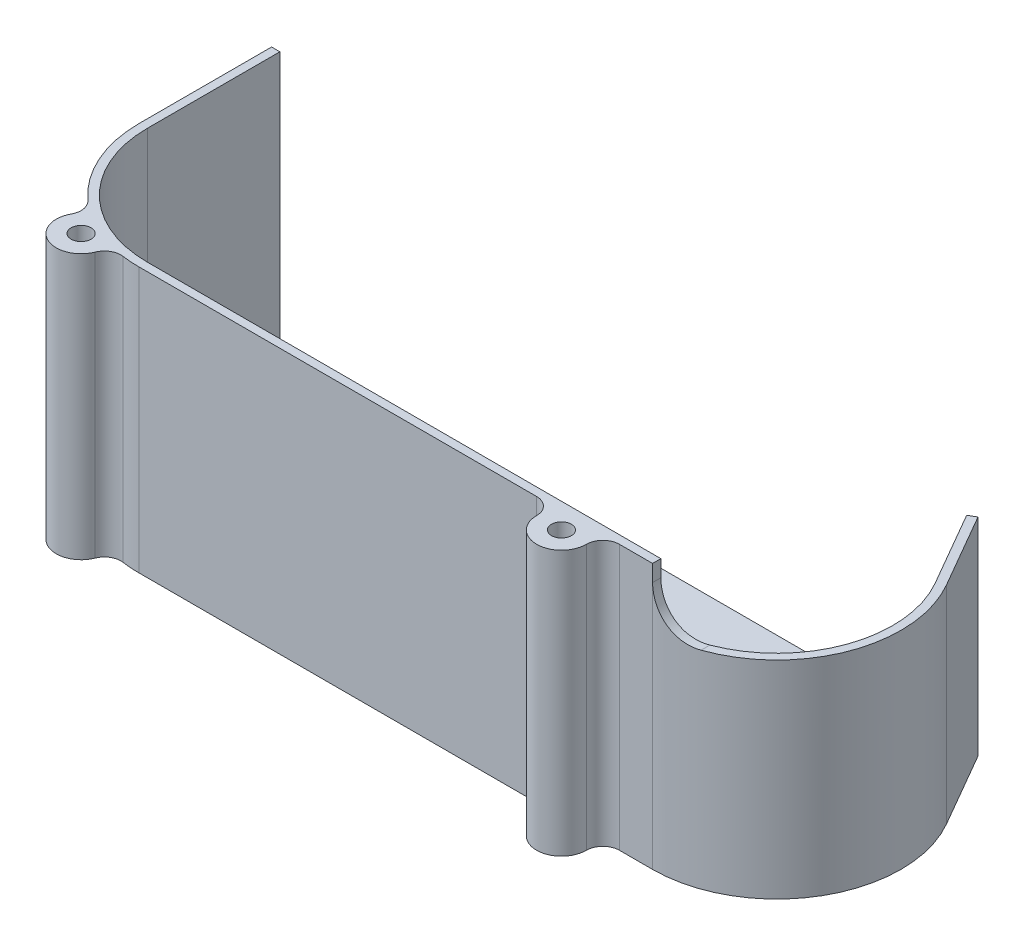
ISO-10303-21;
HEADER;
FILE_DESCRIPTION(('STEP AP214'),'2;1');
FILE_NAME('part.step','',(''),(''),'','','');
FILE_SCHEMA(('AUTOMOTIVE_DESIGN { 1 0 10303 214 1 1 1 1 }'));
ENDSEC;
DATA;
#1=APPLICATION_CONTEXT('core data for automotive mechanical design processes');
#2=APPLICATION_PROTOCOL_DEFINITION('international standard','automotive_design',2000,#1);
#3=PRODUCT_CONTEXT('',#1,'mechanical');
#4=PRODUCT('Part','Part','',(#3));
#5=PRODUCT_RELATED_PRODUCT_CATEGORY('part','',(#4));
#6=PRODUCT_DEFINITION_FORMATION('','',#4);
#7=PRODUCT_DEFINITION_CONTEXT('part definition',#1,'design');
#8=PRODUCT_DEFINITION('design','',#6,#7);
#9=PRODUCT_DEFINITION_SHAPE('','',#8);
#10=(LENGTH_UNIT() NAMED_UNIT(*) SI_UNIT(.MILLI.,.METRE.));
#11=(NAMED_UNIT(*) PLANE_ANGLE_UNIT() SI_UNIT($,.RADIAN.));
#12=(NAMED_UNIT(*) SI_UNIT($,.STERADIAN.) SOLID_ANGLE_UNIT());
#13=UNCERTAINTY_MEASURE_WITH_UNIT(LENGTH_MEASURE(1.E-05),#10,'distance_accuracy_value','');
#14=(GEOMETRIC_REPRESENTATION_CONTEXT(3) GLOBAL_UNCERTAINTY_ASSIGNED_CONTEXT((#13)) GLOBAL_UNIT_ASSIGNED_CONTEXT((#10,
#11,#12)) REPRESENTATION_CONTEXT('',''));
#15=CARTESIAN_POINT('',(0.,0.,0.));
#16=DIRECTION('',(0.,0.,1.));
#17=DIRECTION('',(1.,0.,0.));
#18=AXIS2_PLACEMENT_3D('',#15,#16,#17);
#19=CARTESIAN_POINT('',(12.9903810567665,32.,-21.5000000000002));
#20=DIRECTION('',(-0.866025403784433,0.,0.50000000000001));
#21=DIRECTION('',(0.50000000000001,0.,0.866025403784433));
#22=AXIS2_PLACEMENT_3D('',#19,#20,#21);
#23=PLANE('',#22);
#24=DIRECTION('',(-0.50000000000001,0.,-0.866025403784433));
#25=VECTOR('',#24,1.);
#26=CARTESIAN_POINT('',(12.9903810567665,25.,-21.5000000000002));
#27=LINE('',#26,#25);
#28=CARTESIAN_POINT('',(12.9903810567665,25.,-21.5000000000002));
#29=VERTEX_POINT('',#28);
#30=CARTESIAN_POINT('',(7.7942286340598,25.,-30.5));
#31=VERTEX_POINT('',#30);
#32=EDGE_CURVE('E310',#29,#31,#27,.T.);
#33=ORIENTED_EDGE('',*,*,#32,.F.);
#34=DIRECTION('',(0.,-1.,0.));
#35=VECTOR('',#34,1.);
#36=CARTESIAN_POINT('',(12.9903810567665,32.,-21.5000000000002));
#37=LINE('',#36,#35);
#38=CARTESIAN_POINT('',(12.9903810567665,0.,-21.5000000000002));
#39=VERTEX_POINT('',#38);
#40=EDGE_CURVE('E224',#29,#39,#37,.T.);
#41=ORIENTED_EDGE('',*,*,#40,.T.);
#42=DIRECTION('',(-0.50000000000001,0.,-0.866025403784433));
#43=VECTOR('',#42,1.);
#44=CARTESIAN_POINT('',(12.9903810567665,0.,-21.5000000000002));
#45=LINE('',#44,#43);
#46=CARTESIAN_POINT('',(7.79422863405981,0.,-30.5));
#47=VERTEX_POINT('',#46);
#48=EDGE_CURVE('E371',#39,#47,#45,.T.);
#49=ORIENTED_EDGE('',*,*,#48,.T.);
#50=DIRECTION('',(0.,-1.,0.));
#51=VECTOR('',#50,1.);
#52=CARTESIAN_POINT('',(7.79422863405981,32.,-30.5));
#53=LINE('',#52,#51);
#54=EDGE_CURVE('E253',#31,#47,#53,.T.);
#55=ORIENTED_EDGE('',*,*,#54,.F.);
#56=EDGE_LOOP('',(#33,#41,#49,#55));
#57=FACE_BOUND('',#56,.T.);
#58=ADVANCED_FACE('F37',(#57),#23,.F.);
#59=CARTESIAN_POINT('',(6.92820323027538,32.,-30.));
#60=DIRECTION('',(-0.500000000000011,0.,-0.866025403784432));
#61=DIRECTION('',(-0.866025403784432,0.,0.500000000000011));
#62=AXIS2_PLACEMENT_3D('',#59,#60,#61);
#63=PLANE('',#62);
#64=DIRECTION('',(0.,-1.,0.));
#65=VECTOR('',#64,1.);
#66=CARTESIAN_POINT('',(6.92820323027538,32.,-30.));
#67=LINE('',#66,#65);
#68=CARTESIAN_POINT('',(6.92820323027538,25.,-30.));
#69=VERTEX_POINT('',#68);
#70=CARTESIAN_POINT('',(6.92820323027538,1.,-30.));
#71=VERTEX_POINT('',#70);
#72=EDGE_CURVE('E251',#69,#71,#67,.T.);
#73=ORIENTED_EDGE('',*,*,#72,.F.);
#74=DIRECTION('',(0.866025403784432,0.,-0.500000000000011));
#75=VECTOR('',#74,1.);
#76=CARTESIAN_POINT('',(6.92820323027538,25.,-30.));
#77=LINE('',#76,#75);
#78=EDGE_CURVE('E518',#69,#31,#77,.T.);
#79=ORIENTED_EDGE('',*,*,#78,.T.);
#80=ORIENTED_EDGE('',*,*,#54,.T.);
#81=DIRECTION('',(0.866025403784432,0.,-0.500000000000011));
#82=VECTOR('',#81,1.);
#83=CARTESIAN_POINT('',(6.92820323027538,0.,-30.));
#84=LINE('',#83,#82);
#85=CARTESIAN_POINT('',(6.92820323027538,0.,-30.));
#86=VERTEX_POINT('',#85);
#87=EDGE_CURVE('E374',#86,#47,#84,.T.);
#88=ORIENTED_EDGE('',*,*,#87,.F.);
#89=DIRECTION('',(0.,-1.,0.));
#90=VECTOR('',#89,1.);
#91=CARTESIAN_POINT('',(6.92820323027538,1.,-30.));
#92=LINE('',#91,#90);
#93=EDGE_CURVE('E375',#71,#86,#92,.T.);
#94=ORIENTED_EDGE('',*,*,#93,.F.);
#95=EDGE_LOOP('',(#73,#79,#80,#88,#94));
#96=FACE_BOUND('',#95,.T.);
#97=ADVANCED_FACE('F323',(#96),#63,.T.);
#98=CARTESIAN_POINT('',(12.1243556529821,32.,-21.0000000000001));
#99=DIRECTION('',(-0.866025403784433,0.,0.50000000000001));
#100=DIRECTION('',(0.50000000000001,0.,0.866025403784433));
#101=AXIS2_PLACEMENT_3D('',#98,#99,#100);
#102=PLANE('',#101);
#103=DIRECTION('',(0.,-1.,0.));
#104=VECTOR('',#103,1.);
#105=CARTESIAN_POINT('',(12.1243556529821,32.,-21.0000000000001));
#106=LINE('',#105,#104);
#107=CARTESIAN_POINT('',(12.1243556529821,25.,-21.0000000000001));
#108=VERTEX_POINT('',#107);
#109=CARTESIAN_POINT('',(12.1243556529821,1.,-21.0000000000001));
#110=VERTEX_POINT('',#109);
#111=EDGE_CURVE('E249',#108,#110,#106,.T.);
#112=ORIENTED_EDGE('',*,*,#111,.F.);
#113=DIRECTION('',(-0.50000000000001,0.,-0.866025403784433));
#114=VECTOR('',#113,1.);
#115=CARTESIAN_POINT('',(12.1243556529821,25.,-21.0000000000001));
#116=LINE('',#115,#114);
#117=EDGE_CURVE('E517',#108,#69,#116,.T.);
#118=ORIENTED_EDGE('',*,*,#117,.T.);
#119=ORIENTED_EDGE('',*,*,#72,.T.);
#120=DIRECTION('',(-0.50000000000001,0.,-0.866025403784433));
#121=VECTOR('',#120,1.);
#122=CARTESIAN_POINT('',(12.1243556529821,1.,-21.0000000000001));
#123=LINE('',#122,#121);
#124=EDGE_CURVE('E434',#110,#71,#123,.T.);
#125=ORIENTED_EDGE('',*,*,#124,.F.);
#126=EDGE_LOOP('',(#112,#118,#119,#125));
#127=FACE_BOUND('',#126,.T.);
#128=ADVANCED_FACE('F317',(#127),#102,.T.);
#129=CARTESIAN_POINT('',(0.,32.,-14.));
#130=DIRECTION('',(0.,-1.,0.));
#131=DIRECTION('',(0.,0.,-1.));
#132=AXIS2_PLACEMENT_3D('',#129,#130,#131);
#133=CYLINDRICAL_SURFACE('',#132,14.);
#134=CARTESIAN_POINT('',(0.,30.,0.));
#135=CARTESIAN_POINT('',(-1.50459136833352E-05,29.8595474482807,-1.5884231379151E-05));
#136=CARTESIAN_POINT('',(0.00591744545720111,29.7190970425046,-4.98985140465173E-07));
#137=CARTESIAN_POINT('',(0.0295688916354434,29.4391978635251,-2.19875852244608E-05));
#138=CARTESIAN_POINT('',(0.0472873442795987,29.2997490479029,-5.88592051200603E-05));
#139=CARTESIAN_POINT('',(0.0943896324594716,29.0229116414224,-0.000299577562689162));
#140=CARTESIAN_POINT('',(0.123767279790301,28.8855219977221,-0.000503335784976175));
#141=CARTESIAN_POINT('',(0.193974392342475,28.6137033877794,-0.00129957519120834));
#142=CARTESIAN_POINT('',(0.234803716607997,28.4792743851172,-0.00189205159063903));
#143=CARTESIAN_POINT('',(0.327642317179239,28.2142811290152,-0.00375754593932329));
#144=CARTESIAN_POINT('',(0.3796558145089,28.0837183559557,-0.00503082109961872));
#145=CARTESIAN_POINT('',(0.494500792375081,27.8273964210666,-0.00861803717372882));
#146=CARTESIAN_POINT('',(0.557336265874932,27.701639053279,-0.0109323627116932));
#147=CARTESIAN_POINT('',(0.693319215707162,27.4559472403922,-0.0170126382317593));
#148=CARTESIAN_POINT('',(0.766461475020416,27.3360098903935,-0.0207778554735614));
#149=CARTESIAN_POINT('',(0.922564351536463,27.1027215231903,-0.0302115760215777));
#150=CARTESIAN_POINT('',(1.00552832749662,26.9893727789803,-0.0358807316468934));
#151=CARTESIAN_POINT('',(1.18014190769924,26.7707353219697,-0.0495559387176316));
#152=CARTESIAN_POINT('',(1.27174181671417,26.6654061239684,-0.0575491121288816));
#153=CARTESIAN_POINT('',(1.46328467291827,26.4629012247482,-0.0763490775155528));
#154=CARTESIAN_POINT('',(1.56322743137925,26.3657253391885,-0.0871558058557059));
#155=CARTESIAN_POINT('',(1.77063559459021,26.1802409981676,-0.112028426768187));
#156=CARTESIAN_POINT('',(1.87810023405375,26.0919316428327,-0.126093988117799));
#157=CARTESIAN_POINT('',(2.09961806320074,25.9248282194729,-0.157886146934307));
#158=CARTESIAN_POINT('',(2.21366873893479,25.8460305557813,-0.17561135404853));
#159=CARTESIAN_POINT('',(2.44492941691881,25.7000097247929,-0.214653593531594));
#160=CARTESIAN_POINT('',(2.56202099264341,25.632576397576,-0.235886409666178));
#161=CARTESIAN_POINT('',(2.80058140896661,25.5077089616697,-0.282437959384748));
#162=CARTESIAN_POINT('',(2.9220486316909,25.4502712020537,-0.307755194577371));
#163=CARTESIAN_POINT('',(3.16844955357108,25.3456103958993,-0.362666838547043));
#164=CARTESIAN_POINT('',(3.29338495067415,25.2983924559562,-0.392263373322664));
#165=CARTESIAN_POINT('',(3.54557774425035,25.214361202222,-0.455782935484481));
#166=CARTESIAN_POINT('',(3.67283478940502,25.1775463278856,-0.48970531284958));
#167=CARTESIAN_POINT('',(3.99995398208918,25.0967451473814,-0.581988523224072));
#168=CARTESIAN_POINT('',(4.20084160680261,25.0601539088656,-0.643449887637919));
#169=CARTESIAN_POINT('',(4.50155187728427,25.0238806826301,-0.743030974388413));
#170=CARTESIAN_POINT('',(4.60161495028183,25.0148916739781,-0.777429393360964));
#171=CARTESIAN_POINT('',(4.80125393479612,25.0029525251546,-0.848605096497407));
#172=CARTESIAN_POINT('',(4.90082985376061,25.0000022923706,-0.885382344169966));
#173=CARTESIAN_POINT('',(5.,25.,-0.92330316937798));
#174=B_SPLINE_CURVE_WITH_KNOTS('',3,(#134,#135,#136,#137,#138,#139,#140,#141,#142,#143,#144,
#145,#146,#147,#148,#149,#150,#151,#152,#153,#154,#155,#156,#157,#158,#159,#160,#161,#162,#163,
#164,#165,#166,#167,#168,#169,#170,#171,#172,#173),.UNSPECIFIED.,.F.,.F.,(4,2,2,2,2,2,2,2,2,2,2,
2,2,2,2,2,2,2,2,4),(0.,0.421229396847561,0.84244084756835,1.26342903549733,1.68441204181556,
2.10555421127425,2.52685210293635,2.94793750581534,3.36916732657742,3.7881060873434,
4.2070353736312,4.62592209926266,5.04464997560324,5.45449088035749,5.86418177321673,
6.27407690844541,6.68391052335472,7.32163081315617,7.64004339582657,7.95845109519236),.UNSPECIFIED.);
#175=CARTESIAN_POINT('',(0.,30.,0.));
#176=VERTEX_POINT('',#175);
#177=CARTESIAN_POINT('',(5.00000000000001,25.,-0.923303169377979));
#178=VERTEX_POINT('',#177);
#179=EDGE_CURVE('E196',#176,#178,#174,.T.);
#180=ORIENTED_EDGE('',*,*,#179,.T.);
#181=CARTESIAN_POINT('',(0.,25.,-14.));
#182=DIRECTION('',(0.,1.,0.));
#183=DIRECTION('',(0.,0.,1.));
#184=AXIS2_PLACEMENT_3D('',#181,#182,#183);
#185=CIRCLE('',#184,14.);
#186=EDGE_CURVE('E466',#178,#108,#185,.T.);
#187=ORIENTED_EDGE('',*,*,#186,.T.);
#188=ORIENTED_EDGE('',*,*,#111,.T.);
#189=CARTESIAN_POINT('',(0.,1.,-14.));
#190=DIRECTION('',(0.,1.,0.));
#191=DIRECTION('',(0.,0.,1.));
#192=AXIS2_PLACEMENT_3D('',#189,#190,#191);
#193=CIRCLE('',#192,14.);
#194=CARTESIAN_POINT('',(0.,1.,0.));
#195=VERTEX_POINT('',#194);
#196=EDGE_CURVE('E431',#195,#110,#193,.T.);
#197=ORIENTED_EDGE('',*,*,#196,.F.);
#198=DIRECTION('',(0.,-1.,0.));
#199=VECTOR('',#198,1.);
#200=CARTESIAN_POINT('',(0.,32.,0.));
#201=LINE('',#200,#199);
#202=EDGE_CURVE('E245',#176,#195,#201,.T.);
#203=ORIENTED_EDGE('',*,*,#202,.F.);
#204=EDGE_LOOP('',(#180,#187,#188,#197,#203));
#205=FACE_BOUND('',#204,.T.);
#206=ADVANCED_FACE('F312',(#205),#133,.F.);
#207=CARTESIAN_POINT('',(0.,32.,-14.));
#208=DIRECTION('',(0.,-1.,0.));
#209=DIRECTION('',(0.,0.,-1.));
#210=AXIS2_PLACEMENT_3D('',#207,#208,#209);
#211=CYLINDRICAL_SURFACE('',#210,15.);
#212=ORIENTED_EDGE('',*,*,#40,.F.);
#213=CARTESIAN_POINT('',(0.,25.,-14.));
#214=DIRECTION('',(0.,1.,0.));
#215=DIRECTION('',(0.,0.,1.));
#216=AXIS2_PLACEMENT_3D('',#213,#214,#215);
#217=CIRCLE('',#216,15.);
#218=CARTESIAN_POINT('',(5.00000000000001,25.,0.142135623730954));
#219=VERTEX_POINT('',#218);
#220=EDGE_CURVE('E11',#219,#29,#217,.T.);
#221=ORIENTED_EDGE('',*,*,#220,.F.);
#222=CARTESIAN_POINT('',(0.,30.,1.));
#223=CARTESIAN_POINT('',(-1.50557723248816E-05,29.859524500661,0.999985165135693));
#224=CARTESIAN_POINT('',(0.00591937887122222,29.7190511503713,0.99999953400109));
#225=CARTESIAN_POINT('',(0.0295785391693773,29.4391066659808,0.999979464831016));
#226=CARTESIAN_POINT('',(0.0473027543688381,29.2996354887536,0.999945028908544));
#227=CARTESIAN_POINT('',(0.0944196125030334,29.0227584483567,0.999720216023053));
#228=CARTESIAN_POINT('',(0.12380571829149,28.8853514727955,0.999529926361364));
#229=CARTESIAN_POINT('',(0.194032713112539,28.6134993194047,0.998786338682218));
#230=CARTESIAN_POINT('',(0.234873461310304,28.4790541051823,0.998233045127781));
#231=CARTESIAN_POINT('',(0.327737454190947,28.2140308262161,0.996490973522778));
#232=CARTESIAN_POINT('',(0.379764813416576,28.0834542045384,0.995301961408968));
#233=CARTESIAN_POINT('',(0.494640707313177,27.8271050754734,0.991952247449546));
#234=CARTESIAN_POINT('',(0.557493234105601,27.7013343613978,0.989791186654848));
#235=CARTESIAN_POINT('',(0.693514615428464,27.4556153233231,0.984113786910063));
#236=CARTESIAN_POINT('',(0.766678218403815,27.3356640769469,0.980598136298094));
#237=CARTESIAN_POINT('',(0.922831326274389,27.1023445176333,0.971790040600001));
#238=CARTESIAN_POINT('',(1.005824198578,26.9889784806621,0.966496985446631));
#239=CARTESIAN_POINT('',(1.18056744260777,26.7702263084038,0.953725135980748));
#240=CARTESIAN_POINT('',(1.27227417257161,26.6648047027238,0.946256883430564));
#241=CARTESIAN_POINT('',(1.4640639845286,26.4621161742022,0.92869003692268));
#242=CARTESIAN_POINT('',(1.56414690160924,26.3648490908877,0.918591494742527));
#243=CARTESIAN_POINT('',(1.77188640309537,26.1791769362418,0.895346215558064));
#244=CARTESIAN_POINT('',(1.87954266229876,26.0907714847835,0.88219960938316));
#245=CARTESIAN_POINT('',(2.10150580563289,25.9234773008484,0.852481372631639));
#246=CARTESIAN_POINT('',(2.21581018055179,25.8445850119101,0.835911028332986));
#247=CARTESIAN_POINT('',(2.44797224294831,25.6981820749748,0.799357460888633));
#248=CARTESIAN_POINT('',(2.56572501351447,25.6304878023224,0.779443078215498));
#249=CARTESIAN_POINT('',(2.80572920141634,25.5051699255914,0.735764520908733));
#250=CARTESIAN_POINT('',(2.92797896108697,25.4475426547998,0.712001754078145));
#251=CARTESIAN_POINT('',(3.17606717736967,25.3425961352321,0.660444870829874));
#252=CARTESIAN_POINT('',(3.30190705034083,25.295281020191,0.63264914516836));
#253=CARTESIAN_POINT('',(3.55605239250838,25.2111642645478,0.572973468832597));
#254=CARTESIAN_POINT('',(3.68435746321674,25.1743609397704,0.54109417360548));
#255=CARTESIAN_POINT('',(4.01013574248192,25.0947897137423,0.455449784106062));
#256=CARTESIAN_POINT('',(4.20865979587154,25.058983582435,0.398963428639818));
#257=CARTESIAN_POINT('',(4.50616131971406,25.0234434131473,0.307526579495776));
#258=CARTESIAN_POINT('',(4.60521253674549,25.0146246945528,0.275953936840966));
#259=CARTESIAN_POINT('',(4.80295501699869,25.0029039503455,0.210646128463733));
#260=CARTESIAN_POINT('',(4.90164627271787,25.0000020473598,0.176910917936658));
#261=CARTESIAN_POINT('',(5.,25.,0.142135623730952));
#262=B_SPLINE_CURVE_WITH_KNOTS('',3,(#222,#223,#224,#225,#226,#227,#228,#229,#230,#231,#232,
#233,#234,#235,#236,#237,#238,#239,#240,#241,#242,#243,#244,#245,#246,#247,#248,#249,#250,#251,
#252,#253,#254,#255,#256,#257,#258,#259,#260,#261),.UNSPECIFIED.,.F.,.F.,(4,2,2,2,2,2,2,2,2,2,2,
2,2,2,2,2,2,2,2,4),(0.,0.421298173617718,0.842578107725071,1.26362222352308,1.68466116281057,
2.10585522997914,2.52720495962193,2.9483408611492,3.36962145921057,3.78889342404063,
4.20815713607819,4.62740285575349,5.04649135278261,5.45782348433233,5.86900548222117,
6.2803520047678,6.69163258528923,7.31819571357399,7.63104404912889,7.94389886845451),.UNSPECIFIED.);
#263=CARTESIAN_POINT('',(0.,30.,1.));
#264=VERTEX_POINT('',#263);
#265=EDGE_CURVE('E45',#264,#219,#262,.T.);
#266=ORIENTED_EDGE('',*,*,#265,.F.);
#267=DIRECTION('',(0.,-1.,0.));
#268=VECTOR('',#267,1.);
#269=CARTESIAN_POINT('',(0.,32.,1.));
#270=LINE('',#269,#268);
#271=CARTESIAN_POINT('',(0.,0.,1.));
#272=VERTEX_POINT('',#271);
#273=EDGE_CURVE('E211',#264,#272,#270,.T.);
#274=ORIENTED_EDGE('',*,*,#273,.T.);
#275=CARTESIAN_POINT('',(0.,0.,-14.));
#276=DIRECTION('',(0.,1.,0.));
#277=DIRECTION('',(1.,0.,0.));
#278=AXIS2_PLACEMENT_3D('',#275,#276,#277);
#279=CIRCLE('',#278,15.);
#280=EDGE_CURVE('E387',#272,#39,#279,.T.);
#281=ORIENTED_EDGE('',*,*,#280,.T.);
#282=EDGE_LOOP('',(#212,#221,#266,#274,#281));
#283=FACE_BOUND('',#282,.T.);
#284=ADVANCED_FACE('F216',(#283),#211,.T.);
#285=CARTESIAN_POINT('',(0.,32.,-14.));
#286=DIRECTION('',(0.,1.,0.));
#287=DIRECTION('',(1.,0.,0.));
#288=AXIS2_PLACEMENT_3D('',#285,#286,#287);
#289=PLANE('',#288);
#290=CARTESIAN_POINT('',(-69.,32.,1.00000000000001));
#291=DIRECTION('',(0.,1.,0.));
#292=DIRECTION('',(0.,0.,1.));
#293=AXIS2_PLACEMENT_3D('',#290,#291,#292);
#294=CIRCLE('',#293,1.2);
#295=CARTESIAN_POINT('',(-69.,32.,2.20000000000001));
#296=VERTEX_POINT('',#295);
#297=EDGE_CURVE('E463',#296,#296,#294,.T.);
#298=ORIENTED_EDGE('',*,*,#297,.F.);
#299=EDGE_LOOP('',(#298));
#300=FACE_BOUND('',#299,.T.);
#301=CARTESIAN_POINT('',(-9.00000000000001,32.,3.));
#302=DIRECTION('',(0.,1.,0.));
#303=DIRECTION('',(0.,0.,1.));
#304=AXIS2_PLACEMENT_3D('',#301,#302,#303);
#305=CIRCLE('',#304,1.2);
#306=CARTESIAN_POINT('',(-9.00000000000001,32.,4.2));
#307=VERTEX_POINT('',#306);
#308=EDGE_CURVE('E427',#307,#307,#305,.T.);
#309=ORIENTED_EDGE('',*,*,#308,.F.);
#310=EDGE_LOOP('',(#309));
#311=FACE_BOUND('',#310,.T.);
#312=DIRECTION('',(1.,0.,0.));
#313=VECTOR('',#312,1.);
#314=CARTESIAN_POINT('',(-62.,32.,1.));
#315=LINE('',#314,#313);
#316=CARTESIAN_POINT('',(-4.,32.,1.));
#317=VERTEX_POINT('',#316);
#318=CARTESIAN_POINT('',(0.,32.,1.));
#319=VERTEX_POINT('',#318);
#320=EDGE_CURVE('E365',#317,#319,#315,.T.);
#321=ORIENTED_EDGE('',*,*,#320,.T.);
#322=DIRECTION('',(0.,0.,-1.));
#323=VECTOR('',#322,1.);
#324=CARTESIAN_POINT('',(0.,32.,-14.));
#325=LINE('',#324,#323);
#326=CARTESIAN_POINT('',(0.,32.,0.));
#327=VERTEX_POINT('',#326);
#328=EDGE_CURVE('E205',#319,#327,#325,.T.);
#329=ORIENTED_EDGE('',*,*,#328,.T.);
#330=DIRECTION('',(1.,0.,0.));
#331=VECTOR('',#330,1.);
#332=CARTESIAN_POINT('',(-62.,32.,0.));
#333=LINE('',#332,#331);
#334=CARTESIAN_POINT('',(-62.,32.,0.));
#335=VERTEX_POINT('',#334);
#336=EDGE_CURVE('E388',#335,#327,#333,.T.);
#337=ORIENTED_EDGE('',*,*,#336,.F.);
#338=CARTESIAN_POINT('',(-62.,32.,-14.));
#339=DIRECTION('',(0.,1.,0.));
#340=DIRECTION('',(0.,0.,1.));
#341=AXIS2_PLACEMENT_3D('',#338,#339,#340);
#342=CIRCLE('',#341,14.);
#343=CARTESIAN_POINT('',(-76.,32.,-14.));
#344=VERTEX_POINT('',#343);
#345=EDGE_CURVE('E391',#344,#335,#342,.T.);
#346=ORIENTED_EDGE('',*,*,#345,.F.);
#347=DIRECTION('',(0.,0.,1.));
#348=VECTOR('',#347,1.);
#349=CARTESIAN_POINT('',(-76.,32.,-30.));
#350=LINE('',#349,#348);
#351=CARTESIAN_POINT('',(-76.,32.,-30.));
#352=VERTEX_POINT('',#351);
#353=EDGE_CURVE('E396',#352,#344,#350,.T.);
#354=ORIENTED_EDGE('',*,*,#353,.F.);
#355=DIRECTION('',(1.,0.,0.));
#356=VECTOR('',#355,1.);
#357=CARTESIAN_POINT('',(-77.,32.,-30.));
#358=LINE('',#357,#356);
#359=CARTESIAN_POINT('',(-77.,32.,-30.));
#360=VERTEX_POINT('',#359);
#361=EDGE_CURVE('E366',#360,#352,#358,.T.);
#362=ORIENTED_EDGE('',*,*,#361,.F.);
#363=DIRECTION('',(0.,0.,-1.));
#364=VECTOR('',#363,1.);
#365=CARTESIAN_POINT('',(-77.,32.,-30.));
#366=LINE('',#365,#364);
#367=CARTESIAN_POINT('',(-77.,32.,-14.));
#368=VERTEX_POINT('',#367);
#369=EDGE_CURVE('E363',#360,#368,#366,.F.);
#370=ORIENTED_EDGE('',*,*,#369,.T.);
#371=CARTESIAN_POINT('',(-62.,32.,-14.));
#372=DIRECTION('',(0.,1.,0.));
#373=DIRECTION('',(1.,0.,0.));
#374=AXIS2_PLACEMENT_3D('',#371,#372,#373);
#375=CIRCLE('',#374,15.);
#376=CARTESIAN_POINT('',(-72.0543260191263,32.,-2.86848939716091));
#377=VERTEX_POINT('',#376);
#378=EDGE_CURVE('E362',#368,#377,#375,.T.);
#379=ORIENTED_EDGE('',*,*,#378,.T.);
#380=CARTESIAN_POINT('',(-73.3949028216765,32.,-1.38428798344903));
#381=DIRECTION('',(0.,1.,0.));
#382=DIRECTION('',(0.,0.,1.));
#383=AXIS2_PLACEMENT_3D('',#380,#381,#382);
#384=CIRCLE('',#383,2.);
#385=CARTESIAN_POINT('',(-71.6369416930059,32.,-0.430572790069414));
#386=VERTEX_POINT('',#385);
#387=EDGE_CURVE('E286',#377,#386,#384,.F.);
#388=ORIENTED_EDGE('',*,*,#387,.T.);
#389=CARTESIAN_POINT('',(-69.,32.,1.00000000000001));
#390=DIRECTION('',(0.,1.,0.));
#391=DIRECTION('',(0.,0.,1.));
#392=AXIS2_PLACEMENT_3D('',#389,#390,#391);
#393=CIRCLE('',#392,3.);
#394=CARTESIAN_POINT('',(-66.2097736354612,32.,2.10210563678477));
#395=VERTEX_POINT('',#394);
#396=EDGE_CURVE('E357',#386,#395,#393,.T.);
#397=ORIENTED_EDGE('',*,*,#396,.T.);
#398=CARTESIAN_POINT('',(-64.3496227257687,32.,2.83684272797461));
#399=DIRECTION('',(0.,1.,0.));
#400=DIRECTION('',(0.,0.,1.));
#401=AXIS2_PLACEMENT_3D('',#398,#399,#400);
#402=CIRCLE('',#401,2.);
#403=CARTESIAN_POINT('',(-64.0731965227371,32.,0.856037701154069));
#404=VERTEX_POINT('',#403);
#405=EDGE_CURVE('E283',#395,#404,#402,.F.);
#406=ORIENTED_EDGE('',*,*,#405,.T.);
#407=CARTESIAN_POINT('',(-62.,32.,1.));
#408=VERTEX_POINT('',#407);
#409=EDGE_CURVE('E354',#404,#408,#375,.T.);
#410=ORIENTED_EDGE('',*,*,#409,.T.);
#411=CARTESIAN_POINT('',(-14.,32.,1.));
#412=VERTEX_POINT('',#411);
#413=EDGE_CURVE('E225',#408,#412,#315,.T.);
#414=ORIENTED_EDGE('',*,*,#413,.T.);
#415=CARTESIAN_POINT('',(-14.,32.,3.));
#416=DIRECTION('',(0.,1.,0.));
#417=DIRECTION('',(0.,0.,1.));
#418=AXIS2_PLACEMENT_3D('',#415,#416,#417);
#419=CIRCLE('',#418,2.);
#420=CARTESIAN_POINT('',(-12.,32.,3.));
#421=VERTEX_POINT('',#420);
#422=EDGE_CURVE('E279',#412,#421,#419,.F.);
#423=ORIENTED_EDGE('',*,*,#422,.T.);
#424=CARTESIAN_POINT('',(-9.00000000000001,32.,3.));
#425=DIRECTION('',(0.,1.,0.));
#426=DIRECTION('',(0.,0.,1.));
#427=AXIS2_PLACEMENT_3D('',#424,#425,#426);
#428=CIRCLE('',#427,3.);
#429=CARTESIAN_POINT('',(-6.00000000000001,32.,3.));
#430=VERTEX_POINT('',#429);
#431=EDGE_CURVE('E458',#421,#430,#428,.T.);
#432=ORIENTED_EDGE('',*,*,#431,.T.);
#433=CARTESIAN_POINT('',(-4.00000000000001,32.,3.));
#434=DIRECTION('',(0.,1.,0.));
#435=DIRECTION('',(0.,0.,1.));
#436=AXIS2_PLACEMENT_3D('',#433,#434,#435);
#437=CIRCLE('',#436,2.);
#438=EDGE_CURVE('E275',#430,#317,#437,.F.);
#439=ORIENTED_EDGE('',*,*,#438,.T.);
#440=EDGE_LOOP('',(#321,#329,#337,#346,#354,#362,#370,#379,#388,#397,#406,#410,#414,#423,#432,#439));
#441=FACE_BOUND('',#440,.T.);
#442=ADVANCED_FACE('F352',(#300,#311,#441),#289,.T.);
#443=CARTESIAN_POINT('',(-62.,32.,-14.));
#444=DIRECTION('',(0.,-1.,0.));
#445=DIRECTION('',(0.,0.,-1.));
#446=AXIS2_PLACEMENT_3D('',#443,#444,#445);
#447=CYLINDRICAL_SURFACE('',#446,15.);
#448=CARTESIAN_POINT('',(-62.,0.,-14.));
#449=DIRECTION('',(0.,1.,0.));
#450=DIRECTION('',(1.,0.,0.));
#451=AXIS2_PLACEMENT_3D('',#448,#449,#450);
#452=CIRCLE('',#451,15.);
#453=CARTESIAN_POINT('',(-77.,0.,-14.));
#454=VERTEX_POINT('',#453);
#455=CARTESIAN_POINT('',(-72.0543260191263,0.,-2.86848939716091));
#456=VERTEX_POINT('',#455);
#457=EDGE_CURVE('E383',#454,#456,#452,.T.);
#458=ORIENTED_EDGE('',*,*,#457,.T.);
#459=DIRECTION('',(0.,-1.,0.));
#460=VECTOR('',#459,1.);
#461=CARTESIAN_POINT('',(-72.0543260191263,32.,-2.86848939716091));
#462=LINE('',#461,#460);
#463=EDGE_CURVE('E59',#456,#377,#462,.F.);
#464=ORIENTED_EDGE('',*,*,#463,.T.);
#465=ORIENTED_EDGE('',*,*,#378,.F.);
#466=DIRECTION('',(0.,-1.,0.));
#467=VECTOR('',#466,1.);
#468=CARTESIAN_POINT('',(-77.,32.,-14.));
#469=LINE('',#468,#467);
#470=EDGE_CURVE('E231',#368,#454,#469,.T.);
#471=ORIENTED_EDGE('',*,*,#470,.T.);
#472=EDGE_LOOP('',(#458,#464,#465,#471));
#473=FACE_BOUND('',#472,.T.);
#474=ADVANCED_FACE('F448',(#473),#447,.T.);
#475=ORIENTED_EDGE('',*,*,#409,.F.);
#476=DIRECTION('',(0.,-1.,0.));
#477=VECTOR('',#476,1.);
#478=CARTESIAN_POINT('',(-64.0731965227371,32.,0.856037701154071));
#479=LINE('',#478,#477);
#480=CARTESIAN_POINT('',(-64.0731965227371,0.,0.856037701154069));
#481=VERTEX_POINT('',#480);
#482=EDGE_CURVE('E264',#404,#481,#479,.T.);
#483=ORIENTED_EDGE('',*,*,#482,.T.);
#484=CARTESIAN_POINT('',(-62.,0.,1.));
#485=VERTEX_POINT('',#484);
#486=EDGE_CURVE('E382',#481,#485,#452,.T.);
#487=ORIENTED_EDGE('',*,*,#486,.T.);
#488=DIRECTION('',(0.,-1.,0.));
#489=VECTOR('',#488,1.);
#490=CARTESIAN_POINT('',(-62.,32.,1.));
#491=LINE('',#490,#489);
#492=EDGE_CURVE('E210',#408,#485,#491,.T.);
#493=ORIENTED_EDGE('',*,*,#492,.F.);
#494=EDGE_LOOP('',(#475,#483,#487,#493));
#495=FACE_BOUND('',#494,.T.);
#496=ADVANCED_FACE('F359',(#495),#447,.T.);
#497=CARTESIAN_POINT('',(-62.,32.,1.));
#498=DIRECTION('',(0.,0.,-1.));
#499=DIRECTION('',(-1.,0.,0.));
#500=AXIS2_PLACEMENT_3D('',#497,#498,#499);
#501=PLANE('',#500);
#502=ORIENTED_EDGE('',*,*,#320,.F.);
#503=DIRECTION('',(0.,1.,0.));
#504=VECTOR('',#503,1.);
#505=CARTESIAN_POINT('',(-4.00000000000001,0.,1.));
#506=LINE('',#505,#504);
#507=CARTESIAN_POINT('',(-4.,0.,1.));
#508=VERTEX_POINT('',#507);
#509=EDGE_CURVE('E255',#317,#508,#506,.F.);
#510=ORIENTED_EDGE('',*,*,#509,.T.);
#511=DIRECTION('',(1.,0.,0.));
#512=VECTOR('',#511,1.);
#513=CARTESIAN_POINT('',(-62.,0.,1.));
#514=LINE('',#513,#512);
#515=EDGE_CURVE('E222',#508,#272,#514,.T.);
#516=ORIENTED_EDGE('',*,*,#515,.T.);
#517=ORIENTED_EDGE('',*,*,#273,.F.);
#518=EDGE_CURVE('E202',#319,#264,#270,.T.);
#519=ORIENTED_EDGE('',*,*,#518,.F.);
#520=EDGE_LOOP('',(#502,#510,#516,#517,#519));
#521=FACE_BOUND('',#520,.T.);
#522=ADVANCED_FACE('F219',(#521),#501,.F.);
#523=CARTESIAN_POINT('',(-14.,0.,1.));
#524=VERTEX_POINT('',#523);
#525=EDGE_CURVE('E385',#485,#524,#514,.T.);
#526=ORIENTED_EDGE('',*,*,#525,.T.);
#527=DIRECTION('',(0.,1.,0.));
#528=VECTOR('',#527,1.);
#529=CARTESIAN_POINT('',(-14.,32.,1.));
#530=LINE('',#529,#528);
#531=EDGE_CURVE('E262',#524,#412,#530,.T.);
#532=ORIENTED_EDGE('',*,*,#531,.T.);
#533=ORIENTED_EDGE('',*,*,#413,.F.);
#534=ORIENTED_EDGE('',*,*,#492,.T.);
#535=EDGE_LOOP('',(#526,#532,#533,#534));
#536=FACE_BOUND('',#535,.T.);
#537=ADVANCED_FACE('F510',(#536),#501,.F.);
#538=CARTESIAN_POINT('',(-62.,32.,0.));
#539=DIRECTION('',(0.,0.,-1.));
#540=DIRECTION('',(-1.,0.,0.));
#541=AXIS2_PLACEMENT_3D('',#538,#539,#540);
#542=PLANE('',#541);
#543=DIRECTION('',(1.,0.,0.));
#544=VECTOR('',#543,1.);
#545=CARTESIAN_POINT('',(-62.,1.,0.));
#546=LINE('',#545,#544);
#547=CARTESIAN_POINT('',(-62.,1.,0.));
#548=VERTEX_POINT('',#547);
#549=EDGE_CURVE('E421',#548,#195,#546,.T.);
#550=ORIENTED_EDGE('',*,*,#549,.F.);
#551=DIRECTION('',(0.,-1.,0.));
#552=VECTOR('',#551,1.);
#553=CARTESIAN_POINT('',(-62.,32.,0.));
#554=LINE('',#553,#552);
#555=EDGE_CURVE('E242',#335,#548,#554,.T.);
#556=ORIENTED_EDGE('',*,*,#555,.F.);
#557=ORIENTED_EDGE('',*,*,#336,.T.);
#558=EDGE_CURVE('E246',#327,#176,#201,.T.);
#559=ORIENTED_EDGE('',*,*,#558,.T.);
#560=ORIENTED_EDGE('',*,*,#202,.T.);
#561=EDGE_LOOP('',(#550,#556,#557,#559,#560));
#562=FACE_BOUND('',#561,.T.);
#563=ADVANCED_FACE('F319',(#562),#542,.T.);
#564=CARTESIAN_POINT('',(-62.,32.,-14.));
#565=DIRECTION('',(0.,-1.,0.));
#566=DIRECTION('',(0.,0.,-1.));
#567=AXIS2_PLACEMENT_3D('',#564,#565,#566);
#568=CYLINDRICAL_SURFACE('',#567,14.);
#569=CARTESIAN_POINT('',(-62.,1.,-14.));
#570=DIRECTION('',(0.,1.,0.));
#571=DIRECTION('',(0.,0.,1.));
#572=AXIS2_PLACEMENT_3D('',#569,#570,#571);
#573=CIRCLE('',#572,14.);
#574=CARTESIAN_POINT('',(-76.,1.,-14.));
#575=VERTEX_POINT('',#574);
#576=EDGE_CURVE('E418',#575,#548,#573,.T.);
#577=ORIENTED_EDGE('',*,*,#576,.F.);
#578=DIRECTION('',(0.,-1.,0.));
#579=VECTOR('',#578,1.);
#580=CARTESIAN_POINT('',(-76.,32.,-14.));
#581=LINE('',#580,#579);
#582=EDGE_CURVE('E239',#344,#575,#581,.T.);
#583=ORIENTED_EDGE('',*,*,#582,.F.);
#584=ORIENTED_EDGE('',*,*,#345,.T.);
#585=ORIENTED_EDGE('',*,*,#555,.T.);
#586=EDGE_LOOP('',(#577,#583,#584,#585));
#587=FACE_BOUND('',#586,.T.);
#588=ADVANCED_FACE('F504',(#587),#568,.F.);
#589=CARTESIAN_POINT('',(-76.,32.,-30.));
#590=DIRECTION('',(1.,0.,0.));
#591=DIRECTION('',(0.,0.,-1.));
#592=AXIS2_PLACEMENT_3D('',#589,#590,#591);
#593=PLANE('',#592);
#594=DIRECTION('',(0.,0.,1.));
#595=VECTOR('',#594,1.);
#596=CARTESIAN_POINT('',(-76.,1.,-30.));
#597=LINE('',#596,#595);
#598=CARTESIAN_POINT('',(-76.,1.,-30.));
#599=VERTEX_POINT('',#598);
#600=EDGE_CURVE('E415',#599,#575,#597,.T.);
#601=ORIENTED_EDGE('',*,*,#600,.F.);
#602=DIRECTION('',(0.,-1.,0.));
#603=VECTOR('',#602,1.);
#604=CARTESIAN_POINT('',(-76.,32.,-30.));
#605=LINE('',#604,#603);
#606=EDGE_CURVE('E236',#352,#599,#605,.T.);
#607=ORIENTED_EDGE('',*,*,#606,.F.);
#608=ORIENTED_EDGE('',*,*,#353,.T.);
#609=ORIENTED_EDGE('',*,*,#582,.T.);
#610=EDGE_LOOP('',(#601,#607,#608,#609));
#611=FACE_BOUND('',#610,.T.);
#612=ADVANCED_FACE('F414',(#611),#593,.T.);
#613=CARTESIAN_POINT('',(-77.,32.,-30.));
#614=DIRECTION('',(0.,0.,-1.));
#615=DIRECTION('',(-1.,0.,0.));
#616=AXIS2_PLACEMENT_3D('',#613,#614,#615);
#617=PLANE('',#616);
#618=DIRECTION('',(1.,0.,0.));
#619=VECTOR('',#618,1.);
#620=CARTESIAN_POINT('',(-77.,0.,-30.));
#621=LINE('',#620,#619);
#622=CARTESIAN_POINT('',(-77.,0.,-30.));
#623=VERTEX_POINT('',#622);
#624=EDGE_CURVE('E378',#623,#86,#621,.T.);
#625=ORIENTED_EDGE('',*,*,#624,.F.);
#626=DIRECTION('',(0.,-1.,0.));
#627=VECTOR('',#626,1.);
#628=CARTESIAN_POINT('',(-77.,32.,-30.));
#629=LINE('',#628,#627);
#630=EDGE_CURVE('E234',#360,#623,#629,.T.);
#631=ORIENTED_EDGE('',*,*,#630,.F.);
#632=ORIENTED_EDGE('',*,*,#361,.T.);
#633=ORIENTED_EDGE('',*,*,#606,.T.);
#634=DIRECTION('',(-1.,0.,0.));
#635=VECTOR('',#634,1.);
#636=CARTESIAN_POINT('',(-76.,1.,-30.));
#637=LINE('',#636,#635);
#638=EDGE_CURVE('E436',#71,#599,#637,.T.);
#639=ORIENTED_EDGE('',*,*,#638,.F.);
#640=ORIENTED_EDGE('',*,*,#93,.T.);
#641=EDGE_LOOP('',(#625,#631,#632,#633,#639,#640));
#642=FACE_BOUND('',#641,.T.);
#643=ADVANCED_FACE('F406',(#642),#617,.T.);
#644=CARTESIAN_POINT('',(-77.,32.,-30.));
#645=DIRECTION('',(1.,0.,0.));
#646=DIRECTION('',(0.,0.,-1.));
#647=AXIS2_PLACEMENT_3D('',#644,#645,#646);
#648=PLANE('',#647);
#649=DIRECTION('',(0.,0.,-1.));
#650=VECTOR('',#649,1.);
#651=CARTESIAN_POINT('',(-77.,0.,-30.));
#652=LINE('',#651,#650);
#653=EDGE_CURVE('E380',#623,#454,#652,.F.);
#654=ORIENTED_EDGE('',*,*,#653,.T.);
#655=ORIENTED_EDGE('',*,*,#470,.F.);
#656=ORIENTED_EDGE('',*,*,#369,.F.);
#657=ORIENTED_EDGE('',*,*,#630,.T.);
#658=EDGE_LOOP('',(#654,#655,#656,#657));
#659=FACE_BOUND('',#658,.T.);
#660=ADVANCED_FACE('F447',(#659),#648,.F.);
#661=CARTESIAN_POINT('',(0.,0.,-14.));
#662=DIRECTION('',(0.,1.,0.));
#663=DIRECTION('',(1.,0.,0.));
#664=AXIS2_PLACEMENT_3D('',#661,#662,#663);
#665=PLANE('',#664);
#666=ORIENTED_EDGE('',*,*,#48,.F.);
#667=ORIENTED_EDGE('',*,*,#280,.F.);
#668=ORIENTED_EDGE('',*,*,#515,.F.);
#669=CARTESIAN_POINT('',(-4.00000000000001,0.,3.));
#670=DIRECTION('',(0.,1.,0.));
#671=DIRECTION('',(0.,0.,1.));
#672=AXIS2_PLACEMENT_3D('',#669,#670,#671);
#673=CIRCLE('',#672,2.);
#674=CARTESIAN_POINT('',(-6.00000000000001,0.,3.));
#675=VERTEX_POINT('',#674);
#676=EDGE_CURVE('E273',#508,#675,#673,.T.);
#677=ORIENTED_EDGE('',*,*,#676,.T.);
#678=CARTESIAN_POINT('',(-9.00000000000001,0.,3.));
#679=DIRECTION('',(0.,1.,0.));
#680=DIRECTION('',(0.,0.,1.));
#681=AXIS2_PLACEMENT_3D('',#678,#679,#680);
#682=CIRCLE('',#681,3.);
#683=CARTESIAN_POINT('',(-12.,0.,3.));
#684=VERTEX_POINT('',#683);
#685=EDGE_CURVE('E419',#684,#675,#682,.T.);
#686=ORIENTED_EDGE('',*,*,#685,.F.);
#687=CARTESIAN_POINT('',(-14.,0.,3.));
#688=DIRECTION('',(0.,1.,0.));
#689=DIRECTION('',(0.,0.,1.));
#690=AXIS2_PLACEMENT_3D('',#687,#688,#689);
#691=CIRCLE('',#690,2.);
#692=EDGE_CURVE('E277',#684,#524,#691,.T.);
#693=ORIENTED_EDGE('',*,*,#692,.T.);
#694=ORIENTED_EDGE('',*,*,#525,.F.);
#695=ORIENTED_EDGE('',*,*,#486,.F.);
#696=CARTESIAN_POINT('',(-64.3496227257687,0.,2.83684272797461));
#697=DIRECTION('',(0.,1.,0.));
#698=DIRECTION('',(0.,0.,1.));
#699=AXIS2_PLACEMENT_3D('',#696,#697,#698);
#700=CIRCLE('',#699,2.);
#701=CARTESIAN_POINT('',(-66.2097736354612,0.,2.10210563678477));
#702=VERTEX_POINT('',#701);
#703=EDGE_CURVE('E281',#481,#702,#700,.T.);
#704=ORIENTED_EDGE('',*,*,#703,.T.);
#705=CARTESIAN_POINT('',(-69.,0.,1.00000000000001));
#706=DIRECTION('',(0.,1.,0.));
#707=DIRECTION('',(0.,0.,1.));
#708=AXIS2_PLACEMENT_3D('',#705,#706,#707);
#709=CIRCLE('',#708,3.);
#710=CARTESIAN_POINT('',(-71.6369416930059,0.,-0.430572790069414));
#711=VERTEX_POINT('',#710);
#712=EDGE_CURVE('E454',#711,#702,#709,.T.);
#713=ORIENTED_EDGE('',*,*,#712,.F.);
#714=CARTESIAN_POINT('',(-73.3949028216765,0.,-1.38428798344903));
#715=DIRECTION('',(0.,1.,0.));
#716=DIRECTION('',(0.,0.,1.));
#717=AXIS2_PLACEMENT_3D('',#714,#715,#716);
#718=CIRCLE('',#717,2.);
#719=EDGE_CURVE('E52',#711,#456,#718,.T.);
#720=ORIENTED_EDGE('',*,*,#719,.T.);
#721=ORIENTED_EDGE('',*,*,#457,.F.);
#722=ORIENTED_EDGE('',*,*,#653,.F.);
#723=ORIENTED_EDGE('',*,*,#624,.T.);
#724=ORIENTED_EDGE('',*,*,#87,.T.);
#725=EDGE_LOOP('',(#666,#667,#668,#677,#686,#693,#694,#695,#704,#713,#720,#721,#722,#723,#724));
#726=FACE_BOUND('',#725,.T.);
#727=CARTESIAN_POINT('',(-9.00000000000001,0.,3.));
#728=DIRECTION('',(0.,1.,0.));
#729=DIRECTION('',(0.,0.,1.));
#730=AXIS2_PLACEMENT_3D('',#727,#728,#729);
#731=CIRCLE('',#730,1.2);
#732=CARTESIAN_POINT('',(-9.00000000000001,0.,4.2));
#733=VERTEX_POINT('',#732);
#734=EDGE_CURVE('E424',#733,#733,#731,.T.);
#735=ORIENTED_EDGE('',*,*,#734,.T.);
#736=EDGE_LOOP('',(#735));
#737=FACE_BOUND('',#736,.T.);
#738=CARTESIAN_POINT('',(-69.,0.,1.00000000000001));
#739=DIRECTION('',(0.,1.,0.));
#740=DIRECTION('',(0.,0.,1.));
#741=AXIS2_PLACEMENT_3D('',#738,#739,#740);
#742=CIRCLE('',#741,1.2);
#743=CARTESIAN_POINT('',(-69.,0.,2.20000000000001));
#744=VERTEX_POINT('',#743);
#745=EDGE_CURVE('E455',#744,#744,#742,.T.);
#746=ORIENTED_EDGE('',*,*,#745,.T.);
#747=EDGE_LOOP('',(#746));
#748=FACE_BOUND('',#747,.T.);
#749=ADVANCED_FACE('F443',(#726,#737,#748),#665,.F.);
#750=CARTESIAN_POINT('',(-62.,1.,-14.));
#751=DIRECTION('',(0.,1.,0.));
#752=DIRECTION('',(0.,0.,1.));
#753=AXIS2_PLACEMENT_3D('',#750,#751,#752);
#754=PLANE('',#753);
#755=ORIENTED_EDGE('',*,*,#600,.T.);
#756=ORIENTED_EDGE('',*,*,#576,.T.);
#757=ORIENTED_EDGE('',*,*,#549,.T.);
#758=ORIENTED_EDGE('',*,*,#196,.T.);
#759=ORIENTED_EDGE('',*,*,#124,.T.);
#760=ORIENTED_EDGE('',*,*,#638,.T.);
#761=EDGE_LOOP('',(#755,#756,#757,#758,#759,#760));
#762=FACE_BOUND('',#761,.T.);
#763=ADVANCED_FACE('F490',(#762),#754,.T.);
#764=CARTESIAN_POINT('',(-9.00000000000001,40.2192244806851,3.));
#765=DIRECTION('',(0.,-1.,0.));
#766=DIRECTION('',(0.,0.,-1.));
#767=AXIS2_PLACEMENT_3D('',#764,#765,#766);
#768=CYLINDRICAL_SURFACE('',#767,3.);
#769=ORIENTED_EDGE('',*,*,#685,.T.);
#770=DIRECTION('',(0.,-1.,0.));
#771=VECTOR('',#770,1.);
#772=CARTESIAN_POINT('',(-6.00000000000001,40.2192244806851,3.));
#773=LINE('',#772,#771);
#774=EDGE_CURVE('E260',#675,#430,#773,.F.);
#775=ORIENTED_EDGE('',*,*,#774,.T.);
#776=ORIENTED_EDGE('',*,*,#431,.F.);
#777=DIRECTION('',(0.,-1.,0.));
#778=VECTOR('',#777,1.);
#779=CARTESIAN_POINT('',(-12.,40.2192244806851,3.));
#780=LINE('',#779,#778);
#781=EDGE_CURVE('E257',#421,#684,#780,.T.);
#782=ORIENTED_EDGE('',*,*,#781,.T.);
#783=EDGE_LOOP('',(#769,#775,#776,#782));
#784=FACE_BOUND('',#783,.T.);
#785=ADVANCED_FACE('F476',(#784),#768,.T.);
#786=CARTESIAN_POINT('',(-9.00000000000001,40.2192244806851,3.));
#787=DIRECTION('',(0.,-1.,0.));
#788=DIRECTION('',(0.,0.,-1.));
#789=AXIS2_PLACEMENT_3D('',#786,#787,#788);
#790=CYLINDRICAL_SURFACE('',#789,1.2);
#791=ORIENTED_EDGE('',*,*,#734,.F.);
#792=EDGE_LOOP('',(#791));
#793=FACE_BOUND('',#792,.T.);
#794=ORIENTED_EDGE('',*,*,#308,.T.);
#795=EDGE_LOOP('',(#794));
#796=FACE_BOUND('',#795,.T.);
#797=ADVANCED_FACE('F473',(#793,#796),#790,.F.);
#798=CARTESIAN_POINT('',(-69.,40.2192244806851,1.00000000000001));
#799=DIRECTION('',(0.,-1.,0.));
#800=DIRECTION('',(0.,0.,-1.));
#801=AXIS2_PLACEMENT_3D('',#798,#799,#800);
#802=CYLINDRICAL_SURFACE('',#801,3.);
#803=ORIENTED_EDGE('',*,*,#712,.T.);
#804=DIRECTION('',(0.,-1.,0.));
#805=VECTOR('',#804,1.);
#806=CARTESIAN_POINT('',(-66.2097736354612,40.2192244806851,2.10210563678477));
#807=LINE('',#806,#805);
#808=EDGE_CURVE('E270',#702,#395,#807,.F.);
#809=ORIENTED_EDGE('',*,*,#808,.T.);
#810=ORIENTED_EDGE('',*,*,#396,.F.);
#811=DIRECTION('',(0.,-1.,0.));
#812=VECTOR('',#811,1.);
#813=CARTESIAN_POINT('',(-71.6369416930059,40.2192244806851,-0.430572790069415));
#814=LINE('',#813,#812);
#815=EDGE_CURVE('E267',#386,#711,#814,.T.);
#816=ORIENTED_EDGE('',*,*,#815,.T.);
#817=EDGE_LOOP('',(#803,#809,#810,#816));
#818=FACE_BOUND('',#817,.T.);
#819=ADVANCED_FACE('F453',(#818),#802,.T.);
#820=CARTESIAN_POINT('',(-69.,40.2192244806851,1.00000000000001));
#821=DIRECTION('',(0.,-1.,0.));
#822=DIRECTION('',(0.,0.,-1.));
#823=AXIS2_PLACEMENT_3D('',#820,#821,#822);
#824=CYLINDRICAL_SURFACE('',#823,1.2);
#825=ORIENTED_EDGE('',*,*,#745,.F.);
#826=EDGE_LOOP('',(#825));
#827=FACE_BOUND('',#826,.T.);
#828=ORIENTED_EDGE('',*,*,#297,.T.);
#829=EDGE_LOOP('',(#828));
#830=FACE_BOUND('',#829,.T.);
#831=ADVANCED_FACE('F335',(#827,#830),#824,.F.);
#832=CARTESIAN_POINT('',(-4.00000000000001,40.2192244806851,3.));
#833=DIRECTION('',(0.,-1.,0.));
#834=DIRECTION('',(0.,0.,-1.));
#835=AXIS2_PLACEMENT_3D('',#832,#833,#834);
#836=CYLINDRICAL_SURFACE('',#835,2.);
#837=ORIENTED_EDGE('',*,*,#438,.F.);
#838=ORIENTED_EDGE('',*,*,#774,.F.);
#839=ORIENTED_EDGE('',*,*,#676,.F.);
#840=ORIENTED_EDGE('',*,*,#509,.F.);
#841=EDGE_LOOP('',(#837,#838,#839,#840));
#842=FACE_BOUND('',#841,.T.);
#843=ADVANCED_FACE('F331',(#842),#836,.F.);
#844=CARTESIAN_POINT('',(-14.,40.2192244806851,3.));
#845=DIRECTION('',(0.,-1.,0.));
#846=DIRECTION('',(0.,0.,-1.));
#847=AXIS2_PLACEMENT_3D('',#844,#845,#846);
#848=CYLINDRICAL_SURFACE('',#847,2.);
#849=ORIENTED_EDGE('',*,*,#422,.F.);
#850=ORIENTED_EDGE('',*,*,#531,.F.);
#851=ORIENTED_EDGE('',*,*,#692,.F.);
#852=ORIENTED_EDGE('',*,*,#781,.F.);
#853=EDGE_LOOP('',(#849,#850,#851,#852));
#854=FACE_BOUND('',#853,.T.);
#855=ADVANCED_FACE('F334',(#854),#848,.F.);
#856=CARTESIAN_POINT('',(-64.3496227257687,40.2192244806851,2.83684272797461));
#857=DIRECTION('',(0.,1.,0.));
#858=DIRECTION('',(0.,0.,1.));
#859=AXIS2_PLACEMENT_3D('',#856,#857,#858);
#860=CYLINDRICAL_SURFACE('',#859,2.);
#861=ORIENTED_EDGE('',*,*,#405,.F.);
#862=ORIENTED_EDGE('',*,*,#808,.F.);
#863=ORIENTED_EDGE('',*,*,#703,.F.);
#864=ORIENTED_EDGE('',*,*,#482,.F.);
#865=EDGE_LOOP('',(#861,#862,#863,#864));
#866=FACE_BOUND('',#865,.T.);
#867=ADVANCED_FACE('F338',(#866),#860,.F.);
#868=CARTESIAN_POINT('',(-73.3949028216765,32.,-1.38428798344903));
#869=DIRECTION('',(0.,1.,0.));
#870=DIRECTION('',(0.,0.,1.));
#871=AXIS2_PLACEMENT_3D('',#868,#869,#870);
#872=CYLINDRICAL_SURFACE('',#871,2.);
#873=ORIENTED_EDGE('',*,*,#387,.F.);
#874=ORIENTED_EDGE('',*,*,#463,.F.);
#875=ORIENTED_EDGE('',*,*,#719,.F.);
#876=ORIENTED_EDGE('',*,*,#815,.F.);
#877=EDGE_LOOP('',(#873,#874,#875,#876));
#878=FACE_BOUND('',#877,.T.);
#879=ADVANCED_FACE('F39',(#878),#872,.F.);
#880=CARTESIAN_POINT('',(15.,25.,-30.5));
#881=DIRECTION('',(0.,1.,0.));
#882=DIRECTION('',(0.,0.,1.));
#883=AXIS2_PLACEMENT_3D('',#880,#881,#882);
#884=PLANE('',#883);
#885=DIRECTION('',(0.,0.,1.));
#886=VECTOR('',#885,1.);
#887=CARTESIAN_POINT('',(5.00000000000001,25.,-30.5));
#888=LINE('',#887,#886);
#889=EDGE_CURVE('E199',#178,#219,#888,.T.);
#890=ORIENTED_EDGE('',*,*,#889,.T.);
#891=ORIENTED_EDGE('',*,*,#220,.T.);
#892=ORIENTED_EDGE('',*,*,#32,.T.);
#893=ORIENTED_EDGE('',*,*,#78,.F.);
#894=ORIENTED_EDGE('',*,*,#117,.F.);
#895=ORIENTED_EDGE('',*,*,#186,.F.);
#896=EDGE_LOOP('',(#890,#891,#892,#893,#894,#895));
#897=FACE_BOUND('',#896,.T.);
#898=ADVANCED_FACE('F300',(#897),#884,.T.);
#899=CARTESIAN_POINT('',(5.,30.,-30.5));
#900=DIRECTION('',(0.,0.,1.));
#901=DIRECTION('',(1.,0.,0.));
#902=AXIS2_PLACEMENT_3D('',#899,#900,#901);
#903=CYLINDRICAL_SURFACE('',#902,5.);
#904=DIRECTION('',(0.,0.,1.));
#905=VECTOR('',#904,1.);
#906=CARTESIAN_POINT('',(0.,30.,-30.5));
#907=LINE('',#906,#905);
#908=EDGE_CURVE('E189',#176,#264,#907,.T.);
#909=ORIENTED_EDGE('',*,*,#908,.T.);
#910=ORIENTED_EDGE('',*,*,#265,.T.);
#911=ORIENTED_EDGE('',*,*,#889,.F.);
#912=ORIENTED_EDGE('',*,*,#179,.F.);
#913=EDGE_LOOP('',(#909,#910,#911,#912));
#914=FACE_BOUND('',#913,.T.);
#915=ADVANCED_FACE('F191',(#914),#903,.F.);
#916=CARTESIAN_POINT('',(0.,32.,-30.5));
#917=DIRECTION('',(1.,0.,0.));
#918=DIRECTION('',(0.,0.,-1.));
#919=AXIS2_PLACEMENT_3D('',#916,#917,#918);
#920=PLANE('',#919);
#921=ORIENTED_EDGE('',*,*,#328,.F.);
#922=ORIENTED_EDGE('',*,*,#518,.T.);
#923=ORIENTED_EDGE('',*,*,#908,.F.);
#924=ORIENTED_EDGE('',*,*,#558,.F.);
#925=EDGE_LOOP('',(#921,#922,#923,#924));
#926=FACE_BOUND('',#925,.T.);
#927=ADVANCED_FACE('F203',(#926),#920,.T.);
#928=CLOSED_SHELL('',(#58,#97,#128,#206,#284,#442,#474,#496,#522,#537,#563,#588,#612,#643,#660,
#749,#763,#785,#797,#819,#831,#843,#855,#867,#879,#898,#915,#927));
#929=MANIFOLD_SOLID_BREP('B2',#928);
#930=ADVANCED_BREP_SHAPE_REPRESENTATION('',(#18,#929),#14);
#931=SHAPE_DEFINITION_REPRESENTATION(#9,#930);
ENDSEC;
END-ISO-10303-21;
